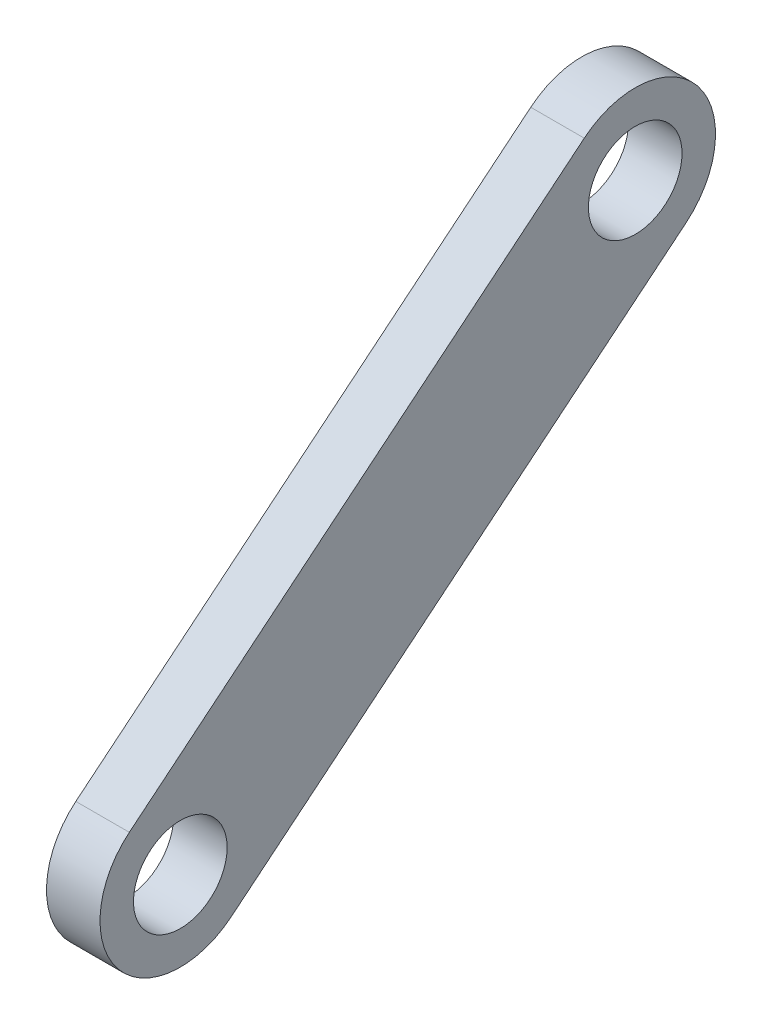
ISO-10303-21;
HEADER;
FILE_DESCRIPTION(('STEP AP214'),'2;1');
FILE_NAME('part.step','',(''),(''),'','','');
FILE_SCHEMA(('AUTOMOTIVE_DESIGN { 1 0 10303 214 1 1 1 1 }'));
ENDSEC;
DATA;
#1=APPLICATION_CONTEXT('core data for automotive mechanical design processes');
#2=APPLICATION_PROTOCOL_DEFINITION('international standard','automotive_design',2000,#1);
#3=PRODUCT_CONTEXT('',#1,'mechanical');
#4=PRODUCT('Part','Part','',(#3));
#5=PRODUCT_RELATED_PRODUCT_CATEGORY('part','',(#4));
#6=PRODUCT_DEFINITION_FORMATION('','',#4);
#7=PRODUCT_DEFINITION_CONTEXT('part definition',#1,'design');
#8=PRODUCT_DEFINITION('design','',#6,#7);
#9=PRODUCT_DEFINITION_SHAPE('','',#8);
#10=(LENGTH_UNIT() NAMED_UNIT(*) SI_UNIT(.MILLI.,.METRE.));
#11=(NAMED_UNIT(*) PLANE_ANGLE_UNIT() SI_UNIT($,.RADIAN.));
#12=(NAMED_UNIT(*) SI_UNIT($,.STERADIAN.) SOLID_ANGLE_UNIT());
#13=UNCERTAINTY_MEASURE_WITH_UNIT(LENGTH_MEASURE(1.E-05),#10,'distance_accuracy_value','');
#14=(GEOMETRIC_REPRESENTATION_CONTEXT(3) GLOBAL_UNCERTAINTY_ASSIGNED_CONTEXT((#13)) GLOBAL_UNIT_ASSIGNED_CONTEXT((#10,
#11,#12)) REPRESENTATION_CONTEXT('',''));
#15=CARTESIAN_POINT('',(0.,0.,0.));
#16=DIRECTION('',(0.,0.,1.));
#17=DIRECTION('',(1.,0.,0.));
#18=AXIS2_PLACEMENT_3D('',#15,#16,#17);
#19=CARTESIAN_POINT('',(12.7,-14.7204545454545,-12.0917624015363));
#20=DIRECTION('',(0.,0.772727272727273,0.634738183807679));
#21=DIRECTION('',(0.,-0.634738183807679,0.772727272727273));
#22=AXIS2_PLACEMENT_3D('',#19,#20,#21);
#23=PLANE('',#22);
#24=DIRECTION('',(0.,0.634738183807679,-0.772727272727273));
#25=VECTOR('',#24,1.);
#26=CARTESIAN_POINT('',(0.,-14.7204545454545,-12.0917624015363));
#27=LINE('',#26,#25);
#28=CARTESIAN_POINT('',(0.,-14.7204545454545,-12.0917624015363));
#29=VERTEX_POINT('',#28);
#30=CARTESIAN_POINT('',(0.,73.9524697324782,-120.041762401536));
#31=VERTEX_POINT('',#30);
#32=EDGE_CURVE('E104',#29,#31,#27,.T.);
#33=ORIENTED_EDGE('',*,*,#32,.T.);
#34=DIRECTION('',(-1.,0.,0.));
#35=VECTOR('',#34,1.);
#36=CARTESIAN_POINT('',(12.7,73.9524697324782,-120.041762401536));
#37=LINE('',#36,#35);
#38=CARTESIAN_POINT('',(12.7,73.9524697324782,-120.041762401536));
#39=VERTEX_POINT('',#38);
#40=EDGE_CURVE('E11',#39,#31,#37,.T.);
#41=ORIENTED_EDGE('',*,*,#40,.F.);
#42=DIRECTION('',(0.,0.634738183807679,-0.772727272727273));
#43=VECTOR('',#42,1.);
#44=CARTESIAN_POINT('',(12.7,-14.7204545454545,-12.0917624015363));
#45=LINE('',#44,#43);
#46=CARTESIAN_POINT('',(12.7,-14.7204545454545,-12.0917624015363));
#47=VERTEX_POINT('',#46);
#48=EDGE_CURVE('E83',#47,#39,#45,.T.);
#49=ORIENTED_EDGE('',*,*,#48,.F.);
#50=DIRECTION('',(-1.,0.,0.));
#51=VECTOR('',#50,1.);
#52=CARTESIAN_POINT('',(12.7,-14.7204545454545,-12.0917624015363));
#53=LINE('',#52,#51);
#54=EDGE_CURVE('E100',#47,#29,#53,.T.);
#55=ORIENTED_EDGE('',*,*,#54,.T.);
#56=EDGE_LOOP('',(#33,#41,#49,#55));
#57=FACE_BOUND('',#56,.T.);
#58=ADVANCED_FACE('F34',(#57),#23,.F.);
#59=CARTESIAN_POINT('',(12.7,88.6729242779328,-107.95));
#60=DIRECTION('',(-1.,0.,0.));
#61=DIRECTION('',(0.,0.,1.));
#62=AXIS2_PLACEMENT_3D('',#59,#60,#61);
#63=CYLINDRICAL_SURFACE('',#62,19.05);
#64=CARTESIAN_POINT('',(0.,88.6729242779328,-107.95));
#65=DIRECTION('',(1.,0.,0.));
#66=DIRECTION('',(0.,0.,-1.));
#67=AXIS2_PLACEMENT_3D('',#64,#65,#66);
#68=CIRCLE('',#67,19.05);
#69=CARTESIAN_POINT('',(0.,103.393378823387,-95.8582375984637));
#70=VERTEX_POINT('',#69);
#71=EDGE_CURVE('E88',#31,#70,#68,.T.);
#72=ORIENTED_EDGE('',*,*,#71,.T.);
#73=DIRECTION('',(-1.,0.,0.));
#74=VECTOR('',#73,1.);
#75=CARTESIAN_POINT('',(12.7,103.393378823387,-95.8582375984637));
#76=LINE('',#75,#74);
#77=CARTESIAN_POINT('',(12.7,103.393378823387,-95.8582375984637));
#78=VERTEX_POINT('',#77);
#79=EDGE_CURVE('E43',#78,#70,#76,.T.);
#80=ORIENTED_EDGE('',*,*,#79,.F.);
#81=CARTESIAN_POINT('',(12.7,88.6729242779328,-107.95));
#82=DIRECTION('',(1.,0.,0.));
#83=DIRECTION('',(0.,0.,-1.));
#84=AXIS2_PLACEMENT_3D('',#81,#82,#83);
#85=CIRCLE('',#84,19.05);
#86=EDGE_CURVE('E77',#39,#78,#85,.T.);
#87=ORIENTED_EDGE('',*,*,#86,.F.);
#88=ORIENTED_EDGE('',*,*,#40,.T.);
#89=EDGE_LOOP('',(#72,#80,#87,#88));
#90=FACE_BOUND('',#89,.T.);
#91=ADVANCED_FACE('F87',(#90),#63,.T.);
#92=CARTESIAN_POINT('',(12.7,14.7204545454545,12.0917624015363));
#93=DIRECTION('',(0.,0.772727272727273,0.634738183807679));
#94=DIRECTION('',(0.,-0.634738183807679,0.772727272727273));
#95=AXIS2_PLACEMENT_3D('',#92,#93,#94);
#96=PLANE('',#95);
#97=DIRECTION('',(0.,0.634738183807679,-0.772727272727273));
#98=VECTOR('',#97,1.);
#99=CARTESIAN_POINT('',(0.,14.7204545454545,12.0917624015363));
#100=LINE('',#99,#98);
#101=CARTESIAN_POINT('',(0.,14.7204545454545,12.0917624015363));
#102=VERTEX_POINT('',#101);
#103=EDGE_CURVE('E108',#102,#70,#100,.T.);
#104=ORIENTED_EDGE('',*,*,#103,.F.);
#105=DIRECTION('',(-1.,0.,0.));
#106=VECTOR('',#105,1.);
#107=CARTESIAN_POINT('',(12.7,14.7204545454545,12.0917624015363));
#108=LINE('',#107,#106);
#109=CARTESIAN_POINT('',(12.7,14.7204545454545,12.0917624015363));
#110=VERTEX_POINT('',#109);
#111=EDGE_CURVE('E67',#110,#102,#108,.T.);
#112=ORIENTED_EDGE('',*,*,#111,.F.);
#113=DIRECTION('',(0.,0.634738183807679,-0.772727272727273));
#114=VECTOR('',#113,1.);
#115=CARTESIAN_POINT('',(12.7,14.7204545454545,12.0917624015363));
#116=LINE('',#115,#114);
#117=EDGE_CURVE('E81',#110,#78,#116,.T.);
#118=ORIENTED_EDGE('',*,*,#117,.T.);
#119=ORIENTED_EDGE('',*,*,#79,.T.);
#120=EDGE_LOOP('',(#104,#112,#118,#119));
#121=FACE_BOUND('',#120,.T.);
#122=ADVANCED_FACE('F92',(#121),#96,.T.);
#123=CARTESIAN_POINT('',(12.7,0.,0.));
#124=DIRECTION('',(-1.,0.,0.));
#125=DIRECTION('',(0.,0.,1.));
#126=AXIS2_PLACEMENT_3D('',#123,#124,#125);
#127=CYLINDRICAL_SURFACE('',#126,19.05);
#128=CARTESIAN_POINT('',(0.,0.,0.));
#129=DIRECTION('',(1.,0.,0.));
#130=DIRECTION('',(0.,0.,-1.));
#131=AXIS2_PLACEMENT_3D('',#128,#129,#130);
#132=CIRCLE('',#131,19.05);
#133=EDGE_CURVE('E70',#102,#29,#132,.T.);
#134=ORIENTED_EDGE('',*,*,#133,.T.);
#135=ORIENTED_EDGE('',*,*,#54,.F.);
#136=CARTESIAN_POINT('',(12.7,0.,0.));
#137=DIRECTION('',(1.,0.,0.));
#138=DIRECTION('',(0.,0.,-1.));
#139=AXIS2_PLACEMENT_3D('',#136,#137,#138);
#140=CIRCLE('',#139,19.05);
#141=EDGE_CURVE('E51',#110,#47,#140,.T.);
#142=ORIENTED_EDGE('',*,*,#141,.F.);
#143=ORIENTED_EDGE('',*,*,#111,.T.);
#144=EDGE_LOOP('',(#134,#135,#142,#143));
#145=FACE_BOUND('',#144,.T.);
#146=ADVANCED_FACE('F136',(#145),#127,.T.);
#147=CARTESIAN_POINT('',(12.7,88.6729242779328,-107.95));
#148=DIRECTION('',(-1.,0.,0.));
#149=DIRECTION('',(0.,0.,1.));
#150=AXIS2_PLACEMENT_3D('',#147,#148,#149);
#151=CYLINDRICAL_SURFACE('',#150,11.1125);
#152=CARTESIAN_POINT('',(12.7,88.6729242779328,-107.95));
#153=DIRECTION('',(1.,0.,0.));
#154=DIRECTION('',(0.,0.,-1.));
#155=AXIS2_PLACEMENT_3D('',#152,#153,#154);
#156=CIRCLE('',#155,11.1125);
#157=CARTESIAN_POINT('',(12.7,88.6729242779328,-119.0625));
#158=VERTEX_POINT('',#157);
#159=EDGE_CURVE('E114',#158,#158,#156,.T.);
#160=ORIENTED_EDGE('',*,*,#159,.T.);
#161=EDGE_LOOP('',(#160));
#162=FACE_BOUND('',#161,.T.);
#163=CARTESIAN_POINT('',(0.,88.6729242779328,-107.95));
#164=DIRECTION('',(1.,0.,0.));
#165=DIRECTION('',(0.,0.,-1.));
#166=AXIS2_PLACEMENT_3D('',#163,#164,#165);
#167=CIRCLE('',#166,11.1125);
#168=CARTESIAN_POINT('',(0.,88.6729242779328,-119.0625));
#169=VERTEX_POINT('',#168);
#170=EDGE_CURVE('E101',#169,#169,#167,.T.);
#171=ORIENTED_EDGE('',*,*,#170,.F.);
#172=EDGE_LOOP('',(#171));
#173=FACE_BOUND('',#172,.T.);
#174=ADVANCED_FACE('F36',(#162,#173),#151,.F.);
#175=CARTESIAN_POINT('',(12.7,0.,0.));
#176=DIRECTION('',(-1.,0.,0.));
#177=DIRECTION('',(0.,0.,1.));
#178=AXIS2_PLACEMENT_3D('',#175,#176,#177);
#179=CYLINDRICAL_SURFACE('',#178,11.1125);
#180=CARTESIAN_POINT('',(12.7,0.,0.));
#181=DIRECTION('',(1.,0.,0.));
#182=DIRECTION('',(0.,0.,-1.));
#183=AXIS2_PLACEMENT_3D('',#180,#181,#182);
#184=CIRCLE('',#183,11.1125);
#185=CARTESIAN_POINT('',(12.7,0.,-11.1125));
#186=VERTEX_POINT('',#185);
#187=EDGE_CURVE('E94',#186,#186,#184,.T.);
#188=ORIENTED_EDGE('',*,*,#187,.T.);
#189=EDGE_LOOP('',(#188));
#190=FACE_BOUND('',#189,.T.);
#191=CARTESIAN_POINT('',(0.,0.,0.));
#192=DIRECTION('',(1.,0.,0.));
#193=DIRECTION('',(0.,0.,-1.));
#194=AXIS2_PLACEMENT_3D('',#191,#192,#193);
#195=CIRCLE('',#194,11.1125);
#196=CARTESIAN_POINT('',(0.,0.,-11.1125));
#197=VERTEX_POINT('',#196);
#198=EDGE_CURVE('E111',#197,#197,#195,.T.);
#199=ORIENTED_EDGE('',*,*,#198,.F.);
#200=EDGE_LOOP('',(#199));
#201=FACE_BOUND('',#200,.T.);
#202=ADVANCED_FACE('F126',(#190,#201),#179,.F.);
#203=CARTESIAN_POINT('',(12.7,0.,0.));
#204=DIRECTION('',(1.,0.,0.));
#205=DIRECTION('',(0.,0.,-1.));
#206=AXIS2_PLACEMENT_3D('',#203,#204,#205);
#207=PLANE('',#206);
#208=ORIENTED_EDGE('',*,*,#159,.F.);
#209=EDGE_LOOP('',(#208));
#210=FACE_BOUND('',#209,.T.);
#211=ORIENTED_EDGE('',*,*,#48,.T.);
#212=ORIENTED_EDGE('',*,*,#86,.T.);
#213=ORIENTED_EDGE('',*,*,#117,.F.);
#214=ORIENTED_EDGE('',*,*,#141,.T.);
#215=EDGE_LOOP('',(#211,#212,#213,#214));
#216=FACE_BOUND('',#215,.T.);
#217=ORIENTED_EDGE('',*,*,#187,.F.);
#218=EDGE_LOOP('',(#217));
#219=FACE_BOUND('',#218,.T.);
#220=ADVANCED_FACE('F78',(#210,#216,#219),#207,.T.);
#221=CARTESIAN_POINT('',(0.,0.,0.));
#222=DIRECTION('',(1.,0.,0.));
#223=DIRECTION('',(0.,0.,-1.));
#224=AXIS2_PLACEMENT_3D('',#221,#222,#223);
#225=PLANE('',#224);
#226=ORIENTED_EDGE('',*,*,#170,.T.);
#227=EDGE_LOOP('',(#226));
#228=FACE_BOUND('',#227,.T.);
#229=ORIENTED_EDGE('',*,*,#32,.F.);
#230=ORIENTED_EDGE('',*,*,#133,.F.);
#231=ORIENTED_EDGE('',*,*,#103,.T.);
#232=ORIENTED_EDGE('',*,*,#71,.F.);
#233=EDGE_LOOP('',(#229,#230,#231,#232));
#234=FACE_BOUND('',#233,.T.);
#235=ORIENTED_EDGE('',*,*,#198,.T.);
#236=EDGE_LOOP('',(#235));
#237=FACE_BOUND('',#236,.T.);
#238=ADVANCED_FACE('F119',(#228,#234,#237),#225,.F.);
#239=CLOSED_SHELL('',(#58,#91,#122,#146,#174,#202,#220,#238));
#240=MANIFOLD_SOLID_BREP('B2',#239);
#241=ADVANCED_BREP_SHAPE_REPRESENTATION('',(#18,#240),#14);
#242=SHAPE_DEFINITION_REPRESENTATION(#9,#241);
ENDSEC;
END-ISO-10303-21;
